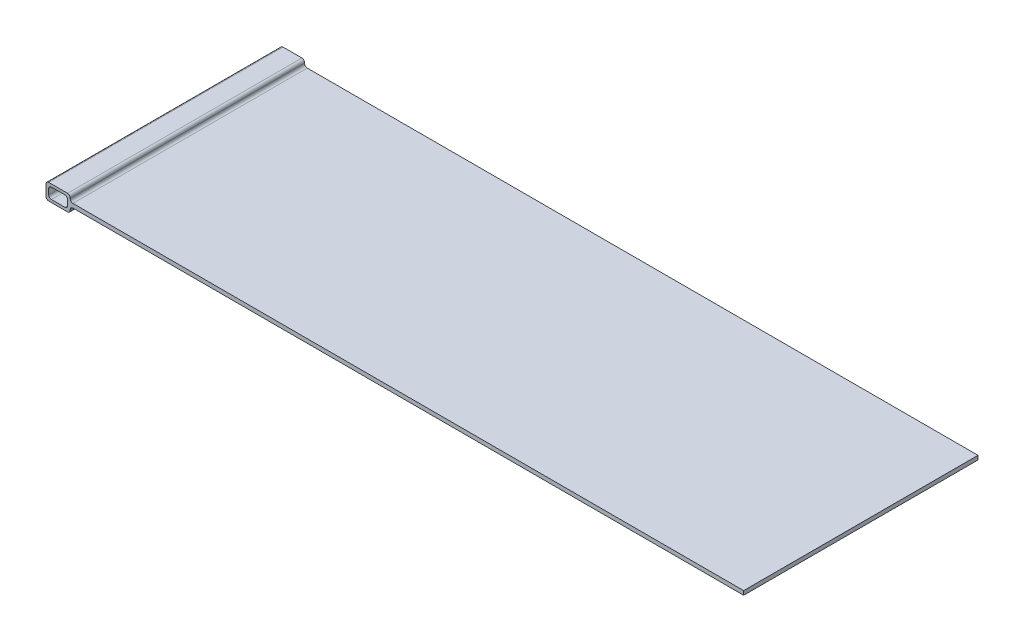
ISO-10303-21;
HEADER;
FILE_DESCRIPTION(('STEP AP214'),'2;1');
FILE_NAME('part.step','',(''),(''),'','','');
FILE_SCHEMA(('AUTOMOTIVE_DESIGN { 1 0 10303 214 1 1 1 1 }'));
ENDSEC;
DATA;
#1=APPLICATION_CONTEXT('core data for automotive mechanical design processes');
#2=APPLICATION_PROTOCOL_DEFINITION('international standard','automotive_design',2000,#1);
#3=PRODUCT_CONTEXT('',#1,'mechanical');
#4=PRODUCT('Part','Part','',(#3));
#5=PRODUCT_RELATED_PRODUCT_CATEGORY('part','',(#4));
#6=PRODUCT_DEFINITION_FORMATION('','',#4);
#7=PRODUCT_DEFINITION_CONTEXT('part definition',#1,'design');
#8=PRODUCT_DEFINITION('design','',#6,#7);
#9=PRODUCT_DEFINITION_SHAPE('','',#8);
#10=(LENGTH_UNIT() NAMED_UNIT(*) SI_UNIT(.MILLI.,.METRE.));
#11=(NAMED_UNIT(*) PLANE_ANGLE_UNIT() SI_UNIT($,.RADIAN.));
#12=(NAMED_UNIT(*) SI_UNIT($,.STERADIAN.) SOLID_ANGLE_UNIT());
#13=UNCERTAINTY_MEASURE_WITH_UNIT(LENGTH_MEASURE(1.E-05),#10,'distance_accuracy_value','');
#14=(GEOMETRIC_REPRESENTATION_CONTEXT(3) GLOBAL_UNCERTAINTY_ASSIGNED_CONTEXT((#13)) GLOBAL_UNIT_ASSIGNED_CONTEXT((#10,
#11,#12)) REPRESENTATION_CONTEXT('',''));
#15=CARTESIAN_POINT('',(0.,0.,0.));
#16=DIRECTION('',(0.,0.,1.));
#17=DIRECTION('',(1.,0.,0.));
#18=AXIS2_PLACEMENT_3D('',#15,#16,#17);
#19=CARTESIAN_POINT('',(259.,-2.25,87.));
#20=DIRECTION('',(-1.,0.,0.));
#21=DIRECTION('',(0.,0.,1.));
#22=AXIS2_PLACEMENT_3D('',#19,#20,#21);
#23=PLANE('',#22);
#24=DIRECTION('',(0.,1.,0.));
#25=VECTOR('',#24,1.);
#26=CARTESIAN_POINT('',(259.,-2.25,0.));
#27=LINE('',#26,#25);
#28=CARTESIAN_POINT('',(259.,-3.75,0.));
#29=VERTEX_POINT('',#28);
#30=CARTESIAN_POINT('',(259.,-2.25,0.));
#31=VERTEX_POINT('',#30);
#32=EDGE_CURVE('E240',#29,#31,#27,.T.);
#33=ORIENTED_EDGE('',*,*,#32,.T.);
#34=DIRECTION('',(0.,0.,-1.));
#35=VECTOR('',#34,1.);
#36=CARTESIAN_POINT('',(259.,-2.25,87.));
#37=LINE('',#36,#35);
#38=CARTESIAN_POINT('',(259.,-2.25,87.));
#39=VERTEX_POINT('',#38);
#40=EDGE_CURVE('E11',#39,#31,#37,.T.);
#41=ORIENTED_EDGE('',*,*,#40,.F.);
#42=DIRECTION('',(0.,1.,0.));
#43=VECTOR('',#42,1.);
#44=CARTESIAN_POINT('',(259.,-2.25,87.));
#45=LINE('',#44,#43);
#46=CARTESIAN_POINT('',(259.,-3.75,87.));
#47=VERTEX_POINT('',#46);
#48=EDGE_CURVE('E252',#47,#39,#45,.T.);
#49=ORIENTED_EDGE('',*,*,#48,.F.);
#50=DIRECTION('',(0.,0.,-1.));
#51=VECTOR('',#50,1.);
#52=CARTESIAN_POINT('',(259.,-3.75,87.));
#53=LINE('',#52,#51);
#54=EDGE_CURVE('E282',#47,#29,#53,.T.);
#55=ORIENTED_EDGE('',*,*,#54,.T.);
#56=EDGE_LOOP('',(#33,#41,#49,#55));
#57=FACE_BOUND('',#56,.T.);
#58=ADVANCED_FACE('F35',(#57),#23,.F.);
#59=CARTESIAN_POINT('',(10.,-2.25,87.));
#60=DIRECTION('',(0.,-1.,0.));
#61=DIRECTION('',(0.,0.,-1.));
#62=AXIS2_PLACEMENT_3D('',#59,#60,#61);
#63=PLANE('',#62);
#64=DIRECTION('',(-1.,0.,0.));
#65=VECTOR('',#64,1.);
#66=CARTESIAN_POINT('',(10.,-2.25,0.));
#67=LINE('',#66,#65);
#68=CARTESIAN_POINT('',(10.,-2.25,0.));
#69=VERTEX_POINT('',#68);
#70=EDGE_CURVE('E285',#31,#69,#67,.T.);
#71=ORIENTED_EDGE('',*,*,#70,.T.);
#72=DIRECTION('',(0.,0.,-1.));
#73=VECTOR('',#72,1.);
#74=CARTESIAN_POINT('',(10.,-2.25,87.));
#75=LINE('',#74,#73);
#76=CARTESIAN_POINT('',(10.,-2.25,87.));
#77=VERTEX_POINT('',#76);
#78=EDGE_CURVE('E42',#77,#69,#75,.T.);
#79=ORIENTED_EDGE('',*,*,#78,.F.);
#80=DIRECTION('',(-1.,0.,0.));
#81=VECTOR('',#80,1.);
#82=CARTESIAN_POINT('',(10.,-2.25,87.));
#83=LINE('',#82,#81);
#84=EDGE_CURVE('E255',#39,#77,#83,.T.);
#85=ORIENTED_EDGE('',*,*,#84,.F.);
#86=ORIENTED_EDGE('',*,*,#40,.T.);
#87=EDGE_LOOP('',(#71,#79,#85,#86));
#88=FACE_BOUND('',#87,.T.);
#89=ADVANCED_FACE('F370',(#88),#63,.F.);
#90=CARTESIAN_POINT('',(10.,-1.25,87.));
#91=DIRECTION('',(0.,0.,-1.));
#92=DIRECTION('',(-1.,0.,0.));
#93=AXIS2_PLACEMENT_3D('',#90,#91,#92);
#94=CYLINDRICAL_SURFACE('',#93,1.);
#95=CARTESIAN_POINT('',(10.,-1.25,0.));
#96=DIRECTION('',(0.,0.,-1.));
#97=DIRECTION('',(-1.,0.,0.));
#98=AXIS2_PLACEMENT_3D('',#95,#96,#97);
#99=CIRCLE('',#98,1.);
#100=CARTESIAN_POINT('',(9.,-1.24999999999999,0.));
#101=VERTEX_POINT('',#100);
#102=EDGE_CURVE('E287',#69,#101,#99,.T.);
#103=ORIENTED_EDGE('',*,*,#102,.T.);
#104=DIRECTION('',(0.,0.,-1.));
#105=VECTOR('',#104,1.);
#106=CARTESIAN_POINT('',(9.,-1.24999999999999,87.));
#107=LINE('',#106,#105);
#108=CARTESIAN_POINT('',(9.,-1.24999999999999,87.));
#109=VERTEX_POINT('',#108);
#110=EDGE_CURVE('E342',#109,#101,#107,.T.);
#111=ORIENTED_EDGE('',*,*,#110,.F.);
#112=CARTESIAN_POINT('',(10.,-1.25,87.));
#113=DIRECTION('',(0.,0.,-1.));
#114=DIRECTION('',(-1.,0.,0.));
#115=AXIS2_PLACEMENT_3D('',#112,#113,#114);
#116=CIRCLE('',#115,1.);
#117=EDGE_CURVE('E258',#77,#109,#116,.T.);
#118=ORIENTED_EDGE('',*,*,#117,.F.);
#119=ORIENTED_EDGE('',*,*,#78,.T.);
#120=EDGE_LOOP('',(#103,#111,#118,#119));
#121=FACE_BOUND('',#120,.T.);
#122=ADVANCED_FACE('F349',(#121),#94,.F.);
#123=CARTESIAN_POINT('',(9.,-1.24999999999999,87.));
#124=DIRECTION('',(-1.,0.,0.));
#125=DIRECTION('',(0.,0.,1.));
#126=AXIS2_PLACEMENT_3D('',#123,#124,#125);
#127=PLANE('',#126);
#128=DIRECTION('',(0.,1.,0.));
#129=VECTOR('',#128,1.);
#130=CARTESIAN_POINT('',(9.,-1.24999999999999,0.));
#131=LINE('',#130,#129);
#132=CARTESIAN_POINT('',(9.,-1.00000000000001,0.));
#133=VERTEX_POINT('',#132);
#134=EDGE_CURVE('E289',#101,#133,#131,.T.);
#135=ORIENTED_EDGE('',*,*,#134,.T.);
#136=DIRECTION('',(0.,0.,-1.));
#137=VECTOR('',#136,1.);
#138=CARTESIAN_POINT('',(9.,-1.00000000000001,87.));
#139=LINE('',#138,#137);
#140=CARTESIAN_POINT('',(9.,-1.00000000000001,87.));
#141=VERTEX_POINT('',#140);
#142=EDGE_CURVE('E339',#141,#133,#139,.T.);
#143=ORIENTED_EDGE('',*,*,#142,.F.);
#144=DIRECTION('',(0.,1.,0.));
#145=VECTOR('',#144,1.);
#146=CARTESIAN_POINT('',(9.,-1.24999999999999,87.));
#147=LINE('',#146,#145);
#148=EDGE_CURVE('E260',#109,#141,#147,.T.);
#149=ORIENTED_EDGE('',*,*,#148,.F.);
#150=ORIENTED_EDGE('',*,*,#110,.T.);
#151=EDGE_LOOP('',(#135,#143,#149,#150));
#152=FACE_BOUND('',#151,.T.);
#153=ADVANCED_FACE('F358',(#152),#127,.F.);
#154=CARTESIAN_POINT('',(8.,-1.,87.));
#155=DIRECTION('',(0.,0.,-1.));
#156=DIRECTION('',(-1.,0.,0.));
#157=AXIS2_PLACEMENT_3D('',#154,#155,#156);
#158=CYLINDRICAL_SURFACE('',#157,1.);
#159=CARTESIAN_POINT('',(8.,-1.,0.));
#160=DIRECTION('',(0.,0.,1.));
#161=DIRECTION('',(-1.,0.,0.));
#162=AXIS2_PLACEMENT_3D('',#159,#160,#161);
#163=CIRCLE('',#162,1.);
#164=CARTESIAN_POINT('',(7.99999999999999,0.,0.));
#165=VERTEX_POINT('',#164);
#166=EDGE_CURVE('E291',#133,#165,#163,.T.);
#167=ORIENTED_EDGE('',*,*,#166,.T.);
#168=DIRECTION('',(0.,0.,-1.));
#169=VECTOR('',#168,1.);
#170=CARTESIAN_POINT('',(7.99999999999999,0.,87.));
#171=LINE('',#170,#169);
#172=CARTESIAN_POINT('',(7.99999999999999,0.,87.));
#173=VERTEX_POINT('',#172);
#174=EDGE_CURVE('E336',#173,#165,#171,.T.);
#175=ORIENTED_EDGE('',*,*,#174,.F.);
#176=CARTESIAN_POINT('',(8.,-1.,87.));
#177=DIRECTION('',(0.,0.,1.));
#178=DIRECTION('',(-1.,0.,0.));
#179=AXIS2_PLACEMENT_3D('',#176,#177,#178);
#180=CIRCLE('',#179,1.);
#181=EDGE_CURVE('E262',#141,#173,#180,.T.);
#182=ORIENTED_EDGE('',*,*,#181,.F.);
#183=ORIENTED_EDGE('',*,*,#142,.T.);
#184=EDGE_LOOP('',(#167,#175,#182,#183));
#185=FACE_BOUND('',#184,.T.);
#186=ADVANCED_FACE('F362',(#185),#158,.T.);
#187=CARTESIAN_POINT('',(1.00000000000001,0.,87.));
#188=DIRECTION('',(0.,-1.,0.));
#189=DIRECTION('',(0.,0.,-1.));
#190=AXIS2_PLACEMENT_3D('',#187,#188,#189);
#191=PLANE('',#190);
#192=DIRECTION('',(-1.,0.,0.));
#193=VECTOR('',#192,1.);
#194=CARTESIAN_POINT('',(1.00000000000001,0.,0.));
#195=LINE('',#194,#193);
#196=CARTESIAN_POINT('',(1.00000000000001,0.,0.));
#197=VERTEX_POINT('',#196);
#198=EDGE_CURVE('E293',#165,#197,#195,.T.);
#199=ORIENTED_EDGE('',*,*,#198,.T.);
#200=DIRECTION('',(0.,0.,-1.));
#201=VECTOR('',#200,1.);
#202=CARTESIAN_POINT('',(1.00000000000001,0.,87.));
#203=LINE('',#202,#201);
#204=CARTESIAN_POINT('',(1.00000000000001,0.,87.));
#205=VERTEX_POINT('',#204);
#206=EDGE_CURVE('E333',#205,#197,#203,.T.);
#207=ORIENTED_EDGE('',*,*,#206,.F.);
#208=DIRECTION('',(-1.,0.,0.));
#209=VECTOR('',#208,1.);
#210=CARTESIAN_POINT('',(1.00000000000001,0.,87.));
#211=LINE('',#210,#209);
#212=EDGE_CURVE('E264',#173,#205,#211,.T.);
#213=ORIENTED_EDGE('',*,*,#212,.F.);
#214=ORIENTED_EDGE('',*,*,#174,.T.);
#215=EDGE_LOOP('',(#199,#207,#213,#214));
#216=FACE_BOUND('',#215,.T.);
#217=ADVANCED_FACE('F413',(#216),#191,.F.);
#218=CARTESIAN_POINT('',(1.,-1.,87.));
#219=DIRECTION('',(0.,0.,-1.));
#220=DIRECTION('',(-1.,0.,0.));
#221=AXIS2_PLACEMENT_3D('',#218,#219,#220);
#222=CYLINDRICAL_SURFACE('',#221,1.);
#223=CARTESIAN_POINT('',(1.,-1.,0.));
#224=DIRECTION('',(0.,0.,1.));
#225=DIRECTION('',(1.,0.,0.));
#226=AXIS2_PLACEMENT_3D('',#223,#224,#225);
#227=CIRCLE('',#226,1.);
#228=CARTESIAN_POINT('',(0.,-1.00000000000001,0.));
#229=VERTEX_POINT('',#228);
#230=EDGE_CURVE('E295',#197,#229,#227,.T.);
#231=ORIENTED_EDGE('',*,*,#230,.T.);
#232=DIRECTION('',(0.,0.,-1.));
#233=VECTOR('',#232,1.);
#234=CARTESIAN_POINT('',(0.,-1.00000000000001,87.));
#235=LINE('',#234,#233);
#236=CARTESIAN_POINT('',(0.,-1.00000000000001,87.));
#237=VERTEX_POINT('',#236);
#238=EDGE_CURVE('E330',#237,#229,#235,.T.);
#239=ORIENTED_EDGE('',*,*,#238,.F.);
#240=CARTESIAN_POINT('',(1.,-1.,87.));
#241=DIRECTION('',(0.,0.,1.));
#242=DIRECTION('',(1.,0.,0.));
#243=AXIS2_PLACEMENT_3D('',#240,#241,#242);
#244=CIRCLE('',#243,1.);
#245=EDGE_CURVE('E266',#205,#237,#244,.T.);
#246=ORIENTED_EDGE('',*,*,#245,.F.);
#247=ORIENTED_EDGE('',*,*,#206,.T.);
#248=EDGE_LOOP('',(#231,#239,#246,#247));
#249=FACE_BOUND('',#248,.T.);
#250=ADVANCED_FACE('F411',(#249),#222,.T.);
#251=CARTESIAN_POINT('',(0.,-1.00000000000001,87.));
#252=DIRECTION('',(1.,0.,0.));
#253=DIRECTION('',(0.,1.,0.));
#254=AXIS2_PLACEMENT_3D('',#251,#252,#253);
#255=PLANE('',#254);
#256=DIRECTION('',(0.,-1.,0.));
#257=VECTOR('',#256,1.);
#258=CARTESIAN_POINT('',(0.,-1.00000000000001,0.));
#259=LINE('',#258,#257);
#260=CARTESIAN_POINT('',(0.,-4.99999999999999,0.));
#261=VERTEX_POINT('',#260);
#262=EDGE_CURVE('E297',#229,#261,#259,.T.);
#263=ORIENTED_EDGE('',*,*,#262,.T.);
#264=DIRECTION('',(0.,0.,-1.));
#265=VECTOR('',#264,1.);
#266=CARTESIAN_POINT('',(0.,-4.99999999999999,87.));
#267=LINE('',#266,#265);
#268=CARTESIAN_POINT('',(0.,-4.99999999999999,87.));
#269=VERTEX_POINT('',#268);
#270=EDGE_CURVE('E327',#269,#261,#267,.T.);
#271=ORIENTED_EDGE('',*,*,#270,.F.);
#272=DIRECTION('',(0.,-1.,0.));
#273=VECTOR('',#272,1.);
#274=CARTESIAN_POINT('',(0.,-1.00000000000001,87.));
#275=LINE('',#274,#273);
#276=EDGE_CURVE('E268',#237,#269,#275,.T.);
#277=ORIENTED_EDGE('',*,*,#276,.F.);
#278=ORIENTED_EDGE('',*,*,#238,.T.);
#279=EDGE_LOOP('',(#263,#271,#277,#278));
#280=FACE_BOUND('',#279,.T.);
#281=ADVANCED_FACE('F406',(#280),#255,.F.);
#282=CARTESIAN_POINT('',(1.,-5.,87.));
#283=DIRECTION('',(0.,0.,-1.));
#284=DIRECTION('',(-1.,0.,0.));
#285=AXIS2_PLACEMENT_3D('',#282,#283,#284);
#286=CYLINDRICAL_SURFACE('',#285,1.);
#287=CARTESIAN_POINT('',(1.,-5.,0.));
#288=DIRECTION('',(0.,0.,1.));
#289=DIRECTION('',(1.,0.,0.));
#290=AXIS2_PLACEMENT_3D('',#287,#288,#289);
#291=CIRCLE('',#290,1.);
#292=CARTESIAN_POINT('',(1.00000000000001,-6.,0.));
#293=VERTEX_POINT('',#292);
#294=EDGE_CURVE('E299',#261,#293,#291,.T.);
#295=ORIENTED_EDGE('',*,*,#294,.T.);
#296=DIRECTION('',(0.,0.,-1.));
#297=VECTOR('',#296,1.);
#298=CARTESIAN_POINT('',(1.00000000000001,-6.,87.));
#299=LINE('',#298,#297);
#300=CARTESIAN_POINT('',(1.00000000000001,-6.,87.));
#301=VERTEX_POINT('',#300);
#302=EDGE_CURVE('E324',#301,#293,#299,.T.);
#303=ORIENTED_EDGE('',*,*,#302,.F.);
#304=CARTESIAN_POINT('',(1.,-5.,87.));
#305=DIRECTION('',(0.,0.,1.));
#306=DIRECTION('',(1.,0.,0.));
#307=AXIS2_PLACEMENT_3D('',#304,#305,#306);
#308=CIRCLE('',#307,1.);
#309=EDGE_CURVE('E270',#269,#301,#308,.T.);
#310=ORIENTED_EDGE('',*,*,#309,.F.);
#311=ORIENTED_EDGE('',*,*,#270,.T.);
#312=EDGE_LOOP('',(#295,#303,#310,#311));
#313=FACE_BOUND('',#312,.T.);
#314=ADVANCED_FACE('F401',(#313),#286,.T.);
#315=CARTESIAN_POINT('',(1.00000000000001,-6.,87.));
#316=DIRECTION('',(0.,1.,0.));
#317=DIRECTION('',(-1.,0.,0.));
#318=AXIS2_PLACEMENT_3D('',#315,#316,#317);
#319=PLANE('',#318);
#320=DIRECTION('',(1.,0.,0.));
#321=VECTOR('',#320,1.);
#322=CARTESIAN_POINT('',(1.00000000000001,-6.,0.));
#323=LINE('',#322,#321);
#324=CARTESIAN_POINT('',(7.99999999999999,-6.,0.));
#325=VERTEX_POINT('',#324);
#326=EDGE_CURVE('E301',#293,#325,#323,.T.);
#327=ORIENTED_EDGE('',*,*,#326,.T.);
#328=DIRECTION('',(0.,0.,-1.));
#329=VECTOR('',#328,1.);
#330=CARTESIAN_POINT('',(7.99999999999999,-6.,87.));
#331=LINE('',#330,#329);
#332=CARTESIAN_POINT('',(7.99999999999999,-6.,87.));
#333=VERTEX_POINT('',#332);
#334=EDGE_CURVE('E321',#333,#325,#331,.T.);
#335=ORIENTED_EDGE('',*,*,#334,.F.);
#336=DIRECTION('',(1.,0.,0.));
#337=VECTOR('',#336,1.);
#338=CARTESIAN_POINT('',(1.00000000000001,-6.,87.));
#339=LINE('',#338,#337);
#340=EDGE_CURVE('E272',#301,#333,#339,.T.);
#341=ORIENTED_EDGE('',*,*,#340,.F.);
#342=ORIENTED_EDGE('',*,*,#302,.T.);
#343=EDGE_LOOP('',(#327,#335,#341,#342));
#344=FACE_BOUND('',#343,.T.);
#345=ADVANCED_FACE('F397',(#344),#319,.F.);
#346=CARTESIAN_POINT('',(8.,-5.,87.));
#347=DIRECTION('',(0.,0.,-1.));
#348=DIRECTION('',(-1.,0.,0.));
#349=AXIS2_PLACEMENT_3D('',#346,#347,#348);
#350=CYLINDRICAL_SURFACE('',#349,1.);
#351=CARTESIAN_POINT('',(8.,-5.,0.));
#352=DIRECTION('',(0.,0.,1.));
#353=DIRECTION('',(1.,0.,0.));
#354=AXIS2_PLACEMENT_3D('',#351,#352,#353);
#355=CIRCLE('',#354,1.);
#356=CARTESIAN_POINT('',(9.,-4.99999999999999,0.));
#357=VERTEX_POINT('',#356);
#358=EDGE_CURVE('E303',#325,#357,#355,.T.);
#359=ORIENTED_EDGE('',*,*,#358,.T.);
#360=DIRECTION('',(0.,0.,-1.));
#361=VECTOR('',#360,1.);
#362=CARTESIAN_POINT('',(9.,-4.99999999999999,87.));
#363=LINE('',#362,#361);
#364=CARTESIAN_POINT('',(9.,-4.99999999999999,87.));
#365=VERTEX_POINT('',#364);
#366=EDGE_CURVE('E318',#365,#357,#363,.T.);
#367=ORIENTED_EDGE('',*,*,#366,.F.);
#368=CARTESIAN_POINT('',(8.,-5.,87.));
#369=DIRECTION('',(0.,0.,1.));
#370=DIRECTION('',(1.,0.,0.));
#371=AXIS2_PLACEMENT_3D('',#368,#369,#370);
#372=CIRCLE('',#371,1.);
#373=EDGE_CURVE('E274',#333,#365,#372,.T.);
#374=ORIENTED_EDGE('',*,*,#373,.F.);
#375=ORIENTED_EDGE('',*,*,#334,.T.);
#376=EDGE_LOOP('',(#359,#367,#374,#375));
#377=FACE_BOUND('',#376,.T.);
#378=ADVANCED_FACE('F392',(#377),#350,.T.);
#379=CARTESIAN_POINT('',(9.,-4.75000000000001,87.));
#380=DIRECTION('',(-1.,0.,0.));
#381=DIRECTION('',(0.,0.,1.));
#382=AXIS2_PLACEMENT_3D('',#379,#380,#381);
#383=PLANE('',#382);
#384=DIRECTION('',(0.,1.,0.));
#385=VECTOR('',#384,1.);
#386=CARTESIAN_POINT('',(9.,-4.75000000000001,0.));
#387=LINE('',#386,#385);
#388=CARTESIAN_POINT('',(9.,-4.75000000000001,0.));
#389=VERTEX_POINT('',#388);
#390=EDGE_CURVE('E305',#357,#389,#387,.T.);
#391=ORIENTED_EDGE('',*,*,#390,.T.);
#392=DIRECTION('',(0.,0.,-1.));
#393=VECTOR('',#392,1.);
#394=CARTESIAN_POINT('',(9.,-4.75000000000001,87.));
#395=LINE('',#394,#393);
#396=CARTESIAN_POINT('',(9.,-4.75000000000001,87.));
#397=VERTEX_POINT('',#396);
#398=EDGE_CURVE('E315',#397,#389,#395,.T.);
#399=ORIENTED_EDGE('',*,*,#398,.F.);
#400=DIRECTION('',(0.,1.,0.));
#401=VECTOR('',#400,1.);
#402=CARTESIAN_POINT('',(9.,-4.75000000000001,87.));
#403=LINE('',#402,#401);
#404=EDGE_CURVE('E276',#365,#397,#403,.T.);
#405=ORIENTED_EDGE('',*,*,#404,.F.);
#406=ORIENTED_EDGE('',*,*,#366,.T.);
#407=EDGE_LOOP('',(#391,#399,#405,#406));
#408=FACE_BOUND('',#407,.T.);
#409=ADVANCED_FACE('F386',(#408),#383,.F.);
#410=CARTESIAN_POINT('',(10.,-4.75,87.));
#411=DIRECTION('',(0.,0.,-1.));
#412=DIRECTION('',(-1.,0.,0.));
#413=AXIS2_PLACEMENT_3D('',#410,#411,#412);
#414=CYLINDRICAL_SURFACE('',#413,1.);
#415=CARTESIAN_POINT('',(10.,-4.75,0.));
#416=DIRECTION('',(0.,0.,-1.));
#417=DIRECTION('',(-1.,0.,0.));
#418=AXIS2_PLACEMENT_3D('',#415,#416,#417);
#419=CIRCLE('',#418,1.);
#420=CARTESIAN_POINT('',(10.,-3.75,0.));
#421=VERTEX_POINT('',#420);
#422=EDGE_CURVE('E307',#389,#421,#419,.T.);
#423=ORIENTED_EDGE('',*,*,#422,.T.);
#424=DIRECTION('',(0.,0.,-1.));
#425=VECTOR('',#424,1.);
#426=CARTESIAN_POINT('',(10.,-3.75,87.));
#427=LINE('',#426,#425);
#428=CARTESIAN_POINT('',(10.,-3.75,87.));
#429=VERTEX_POINT('',#428);
#430=EDGE_CURVE('E312',#429,#421,#427,.T.);
#431=ORIENTED_EDGE('',*,*,#430,.F.);
#432=CARTESIAN_POINT('',(10.,-4.75,87.));
#433=DIRECTION('',(0.,0.,-1.));
#434=DIRECTION('',(-1.,0.,0.));
#435=AXIS2_PLACEMENT_3D('',#432,#433,#434);
#436=CIRCLE('',#435,1.);
#437=EDGE_CURVE('E278',#397,#429,#436,.T.);
#438=ORIENTED_EDGE('',*,*,#437,.F.);
#439=ORIENTED_EDGE('',*,*,#398,.T.);
#440=EDGE_LOOP('',(#423,#431,#438,#439));
#441=FACE_BOUND('',#440,.T.);
#442=ADVANCED_FACE('F382',(#441),#414,.F.);
#443=CARTESIAN_POINT('',(10.,-3.75,87.));
#444=DIRECTION('',(0.,1.,0.));
#445=DIRECTION('',(0.,0.,1.));
#446=AXIS2_PLACEMENT_3D('',#443,#444,#445);
#447=PLANE('',#446);
#448=DIRECTION('',(1.,0.,0.));
#449=VECTOR('',#448,1.);
#450=CARTESIAN_POINT('',(10.,-3.75,0.));
#451=LINE('',#450,#449);
#452=EDGE_CURVE('E256',#421,#29,#451,.T.);
#453=ORIENTED_EDGE('',*,*,#452,.T.);
#454=ORIENTED_EDGE('',*,*,#54,.F.);
#455=DIRECTION('',(1.,0.,0.));
#456=VECTOR('',#455,1.);
#457=CARTESIAN_POINT('',(10.,-3.75,87.));
#458=LINE('',#457,#456);
#459=EDGE_CURVE('E280',#429,#47,#458,.T.);
#460=ORIENTED_EDGE('',*,*,#459,.F.);
#461=ORIENTED_EDGE('',*,*,#430,.T.);
#462=EDGE_LOOP('',(#453,#454,#460,#461));
#463=FACE_BOUND('',#462,.T.);
#464=ADVANCED_FACE('F377',(#463),#447,.F.);
#465=CARTESIAN_POINT('',(10.,-4.75,87.));
#466=DIRECTION('',(0.,0.,-1.));
#467=DIRECTION('',(-1.,0.,0.));
#468=AXIS2_PLACEMENT_3D('',#465,#466,#467);
#469=PLANE('',#468);
#470=DIRECTION('',(-1.,0.,0.));
#471=VECTOR('',#470,1.);
#472=CARTESIAN_POINT('',(2.00000000000001,-1.,87.));
#473=LINE('',#472,#471);
#474=CARTESIAN_POINT('',(6.99999999999999,-1.,87.));
#475=VERTEX_POINT('',#474);
#476=CARTESIAN_POINT('',(2.00000000000001,-1.,87.));
#477=VERTEX_POINT('',#476);
#478=EDGE_CURVE('E222',#475,#477,#473,.T.);
#479=ORIENTED_EDGE('',*,*,#478,.F.);
#480=CARTESIAN_POINT('',(7.,-2.,87.));
#481=DIRECTION('',(0.,0.,1.));
#482=DIRECTION('',(-1.,0.,0.));
#483=AXIS2_PLACEMENT_3D('',#480,#481,#482);
#484=CIRCLE('',#483,1.);
#485=CARTESIAN_POINT('',(8.,-2.00000000000001,87.));
#486=VERTEX_POINT('',#485);
#487=EDGE_CURVE('E49',#486,#475,#484,.T.);
#488=ORIENTED_EDGE('',*,*,#487,.F.);
#489=DIRECTION('',(0.,1.,0.));
#490=VECTOR('',#489,1.);
#491=CARTESIAN_POINT('',(8.,-2.00000000000001,87.));
#492=LINE('',#491,#490);
#493=CARTESIAN_POINT('',(8.,-3.99999999999999,87.));
#494=VERTEX_POINT('',#493);
#495=EDGE_CURVE('E202',#494,#486,#492,.T.);
#496=ORIENTED_EDGE('',*,*,#495,.F.);
#497=CARTESIAN_POINT('',(7.,-4.,87.));
#498=DIRECTION('',(0.,0.,1.));
#499=DIRECTION('',(1.,0.,0.));
#500=AXIS2_PLACEMENT_3D('',#497,#498,#499);
#501=CIRCLE('',#500,1.);
#502=CARTESIAN_POINT('',(6.99999999999999,-5.,87.));
#503=VERTEX_POINT('',#502);
#504=EDGE_CURVE('E205',#503,#494,#501,.T.);
#505=ORIENTED_EDGE('',*,*,#504,.F.);
#506=DIRECTION('',(1.,0.,0.));
#507=VECTOR('',#506,1.);
#508=CARTESIAN_POINT('',(2.00000000000001,-5.,87.));
#509=LINE('',#508,#507);
#510=CARTESIAN_POINT('',(2.00000000000001,-5.,87.));
#511=VERTEX_POINT('',#510);
#512=EDGE_CURVE('E233',#511,#503,#509,.T.);
#513=ORIENTED_EDGE('',*,*,#512,.F.);
#514=CARTESIAN_POINT('',(2.,-4.,87.));
#515=DIRECTION('',(0.,0.,1.));
#516=DIRECTION('',(1.,0.,0.));
#517=AXIS2_PLACEMENT_3D('',#514,#515,#516);
#518=CIRCLE('',#517,1.);
#519=CARTESIAN_POINT('',(1.,-3.99999999999999,87.));
#520=VERTEX_POINT('',#519);
#521=EDGE_CURVE('E230',#520,#511,#518,.T.);
#522=ORIENTED_EDGE('',*,*,#521,.F.);
#523=DIRECTION('',(0.,-1.,0.));
#524=VECTOR('',#523,1.);
#525=CARTESIAN_POINT('',(1.,-2.00000000000001,87.));
#526=LINE('',#525,#524);
#527=CARTESIAN_POINT('',(1.,-2.00000000000001,87.));
#528=VERTEX_POINT('',#527);
#529=EDGE_CURVE('E227',#528,#520,#526,.T.);
#530=ORIENTED_EDGE('',*,*,#529,.F.);
#531=CARTESIAN_POINT('',(2.,-2.,87.));
#532=DIRECTION('',(0.,0.,1.));
#533=DIRECTION('',(1.,0.,0.));
#534=AXIS2_PLACEMENT_3D('',#531,#532,#533);
#535=CIRCLE('',#534,1.);
#536=EDGE_CURVE('E224',#477,#528,#535,.T.);
#537=ORIENTED_EDGE('',*,*,#536,.F.);
#538=EDGE_LOOP('',(#479,#488,#496,#505,#513,#522,#530,#537));
#539=FACE_BOUND('',#538,.T.);
#540=ORIENTED_EDGE('',*,*,#48,.T.);
#541=ORIENTED_EDGE('',*,*,#84,.T.);
#542=ORIENTED_EDGE('',*,*,#117,.T.);
#543=ORIENTED_EDGE('',*,*,#148,.T.);
#544=ORIENTED_EDGE('',*,*,#181,.T.);
#545=ORIENTED_EDGE('',*,*,#212,.T.);
#546=ORIENTED_EDGE('',*,*,#245,.T.);
#547=ORIENTED_EDGE('',*,*,#276,.T.);
#548=ORIENTED_EDGE('',*,*,#309,.T.);
#549=ORIENTED_EDGE('',*,*,#340,.T.);
#550=ORIENTED_EDGE('',*,*,#373,.T.);
#551=ORIENTED_EDGE('',*,*,#404,.T.);
#552=ORIENTED_EDGE('',*,*,#437,.T.);
#553=ORIENTED_EDGE('',*,*,#459,.T.);
#554=EDGE_LOOP('',(#540,#541,#542,#543,#544,#545,#546,#547,#548,#549,#550,#551,#552,#553));
#555=FACE_BOUND('',#554,.T.);
#556=ADVANCED_FACE('F366',(#539,#555),#469,.F.);
#557=CARTESIAN_POINT('',(10.,-4.75,0.));
#558=DIRECTION('',(0.,0.,-1.));
#559=DIRECTION('',(-1.,0.,0.));
#560=AXIS2_PLACEMENT_3D('',#557,#558,#559);
#561=PLANE('',#560);
#562=CARTESIAN_POINT('',(7.,-2.,0.));
#563=DIRECTION('',(0.,0.,1.));
#564=DIRECTION('',(-1.,0.,0.));
#565=AXIS2_PLACEMENT_3D('',#562,#563,#564);
#566=CIRCLE('',#565,1.);
#567=CARTESIAN_POINT('',(8.,-2.00000000000001,0.));
#568=VERTEX_POINT('',#567);
#569=CARTESIAN_POINT('',(6.99999999999999,-1.,0.));
#570=VERTEX_POINT('',#569);
#571=EDGE_CURVE('E185',#568,#570,#566,.T.);
#572=ORIENTED_EDGE('',*,*,#571,.T.);
#573=DIRECTION('',(-1.,0.,0.));
#574=VECTOR('',#573,1.);
#575=CARTESIAN_POINT('',(2.00000000000001,-1.,0.));
#576=LINE('',#575,#574);
#577=CARTESIAN_POINT('',(2.00000000000001,-1.,0.));
#578=VERTEX_POINT('',#577);
#579=EDGE_CURVE('E194',#570,#578,#576,.T.);
#580=ORIENTED_EDGE('',*,*,#579,.T.);
#581=CARTESIAN_POINT('',(2.,-2.,0.));
#582=DIRECTION('',(0.,0.,1.));
#583=DIRECTION('',(1.,0.,0.));
#584=AXIS2_PLACEMENT_3D('',#581,#582,#583);
#585=CIRCLE('',#584,1.);
#586=CARTESIAN_POINT('',(1.,-2.00000000000001,0.));
#587=VERTEX_POINT('',#586);
#588=EDGE_CURVE('E57',#578,#587,#585,.T.);
#589=ORIENTED_EDGE('',*,*,#588,.T.);
#590=DIRECTION('',(0.,-1.,0.));
#591=VECTOR('',#590,1.);
#592=CARTESIAN_POINT('',(1.,-2.00000000000001,0.));
#593=LINE('',#592,#591);
#594=CARTESIAN_POINT('',(1.,-3.99999999999999,0.));
#595=VERTEX_POINT('',#594);
#596=EDGE_CURVE('E209',#587,#595,#593,.T.);
#597=ORIENTED_EDGE('',*,*,#596,.T.);
#598=CARTESIAN_POINT('',(2.,-4.,0.));
#599=DIRECTION('',(0.,0.,1.));
#600=DIRECTION('',(1.,0.,0.));
#601=AXIS2_PLACEMENT_3D('',#598,#599,#600);
#602=CIRCLE('',#601,1.);
#603=CARTESIAN_POINT('',(2.00000000000001,-5.,0.));
#604=VERTEX_POINT('',#603);
#605=EDGE_CURVE('E212',#595,#604,#602,.T.);
#606=ORIENTED_EDGE('',*,*,#605,.T.);
#607=DIRECTION('',(1.,0.,0.));
#608=VECTOR('',#607,1.);
#609=CARTESIAN_POINT('',(2.00000000000001,-5.,0.));
#610=LINE('',#609,#608);
#611=CARTESIAN_POINT('',(6.99999999999999,-5.,0.));
#612=VERTEX_POINT('',#611);
#613=EDGE_CURVE('E215',#604,#612,#610,.T.);
#614=ORIENTED_EDGE('',*,*,#613,.T.);
#615=CARTESIAN_POINT('',(7.,-4.,0.));
#616=DIRECTION('',(0.,0.,1.));
#617=DIRECTION('',(1.,0.,0.));
#618=AXIS2_PLACEMENT_3D('',#615,#616,#617);
#619=CIRCLE('',#618,1.);
#620=CARTESIAN_POINT('',(8.,-3.99999999999999,0.));
#621=VERTEX_POINT('',#620);
#622=EDGE_CURVE('E218',#612,#621,#619,.T.);
#623=ORIENTED_EDGE('',*,*,#622,.T.);
#624=DIRECTION('',(0.,1.,0.));
#625=VECTOR('',#624,1.);
#626=CARTESIAN_POINT('',(8.,-2.00000000000001,0.));
#627=LINE('',#626,#625);
#628=EDGE_CURVE('E191',#621,#568,#627,.T.);
#629=ORIENTED_EDGE('',*,*,#628,.T.);
#630=EDGE_LOOP('',(#572,#580,#589,#597,#606,#614,#623,#629));
#631=FACE_BOUND('',#630,.T.);
#632=ORIENTED_EDGE('',*,*,#32,.F.);
#633=ORIENTED_EDGE('',*,*,#452,.F.);
#634=ORIENTED_EDGE('',*,*,#422,.F.);
#635=ORIENTED_EDGE('',*,*,#390,.F.);
#636=ORIENTED_EDGE('',*,*,#358,.F.);
#637=ORIENTED_EDGE('',*,*,#326,.F.);
#638=ORIENTED_EDGE('',*,*,#294,.F.);
#639=ORIENTED_EDGE('',*,*,#262,.F.);
#640=ORIENTED_EDGE('',*,*,#230,.F.);
#641=ORIENTED_EDGE('',*,*,#198,.F.);
#642=ORIENTED_EDGE('',*,*,#166,.F.);
#643=ORIENTED_EDGE('',*,*,#134,.F.);
#644=ORIENTED_EDGE('',*,*,#102,.F.);
#645=ORIENTED_EDGE('',*,*,#70,.F.);
#646=EDGE_LOOP('',(#632,#633,#634,#635,#636,#637,#638,#639,#640,#641,#642,#643,#644,#645));
#647=FACE_BOUND('',#646,.T.);
#648=ADVANCED_FACE('F198',(#631,#647),#561,.T.);
#649=CARTESIAN_POINT('',(7.,-2.,0.));
#650=DIRECTION('',(0.,0.,1.));
#651=DIRECTION('',(1.,0.,0.));
#652=AXIS2_PLACEMENT_3D('',#649,#650,#651);
#653=CYLINDRICAL_SURFACE('',#652,1.);
#654=ORIENTED_EDGE('',*,*,#487,.T.);
#655=DIRECTION('',(0.,0.,1.));
#656=VECTOR('',#655,1.);
#657=CARTESIAN_POINT('',(6.99999999999999,-1.,0.));
#658=LINE('',#657,#656);
#659=EDGE_CURVE('E181',#570,#475,#658,.T.);
#660=ORIENTED_EDGE('',*,*,#659,.F.);
#661=ORIENTED_EDGE('',*,*,#571,.F.);
#662=DIRECTION('',(0.,0.,1.));
#663=VECTOR('',#662,1.);
#664=CARTESIAN_POINT('',(8.,-2.00000000000001,0.));
#665=LINE('',#664,#663);
#666=EDGE_CURVE('E238',#568,#486,#665,.T.);
#667=ORIENTED_EDGE('',*,*,#666,.T.);
#668=EDGE_LOOP('',(#654,#660,#661,#667));
#669=FACE_BOUND('',#668,.T.);
#670=ADVANCED_FACE('F183',(#669),#653,.F.);
#671=CARTESIAN_POINT('',(8.,-2.00000000000001,0.));
#672=DIRECTION('',(1.,0.,0.));
#673=DIRECTION('',(0.,0.,-1.));
#674=AXIS2_PLACEMENT_3D('',#671,#672,#673);
#675=PLANE('',#674);
#676=ORIENTED_EDGE('',*,*,#495,.T.);
#677=ORIENTED_EDGE('',*,*,#666,.F.);
#678=ORIENTED_EDGE('',*,*,#628,.F.);
#679=DIRECTION('',(0.,0.,1.));
#680=VECTOR('',#679,1.);
#681=CARTESIAN_POINT('',(8.,-3.99999999999999,0.));
#682=LINE('',#681,#680);
#683=EDGE_CURVE('E241',#621,#494,#682,.T.);
#684=ORIENTED_EDGE('',*,*,#683,.T.);
#685=EDGE_LOOP('',(#676,#677,#678,#684));
#686=FACE_BOUND('',#685,.T.);
#687=ADVANCED_FACE('F532',(#686),#675,.F.);
#688=CARTESIAN_POINT('',(7.,-4.,0.));
#689=DIRECTION('',(0.,0.,1.));
#690=DIRECTION('',(1.,0.,0.));
#691=AXIS2_PLACEMENT_3D('',#688,#689,#690);
#692=CYLINDRICAL_SURFACE('',#691,1.);
#693=ORIENTED_EDGE('',*,*,#504,.T.);
#694=ORIENTED_EDGE('',*,*,#683,.F.);
#695=ORIENTED_EDGE('',*,*,#622,.F.);
#696=DIRECTION('',(0.,0.,1.));
#697=VECTOR('',#696,1.);
#698=CARTESIAN_POINT('',(6.99999999999999,-5.,0.));
#699=LINE('',#698,#697);
#700=EDGE_CURVE('E243',#612,#503,#699,.T.);
#701=ORIENTED_EDGE('',*,*,#700,.T.);
#702=EDGE_LOOP('',(#693,#694,#695,#701));
#703=FACE_BOUND('',#702,.T.);
#704=ADVANCED_FACE('F541',(#703),#692,.F.);
#705=CARTESIAN_POINT('',(2.00000000000001,-5.,0.));
#706=DIRECTION('',(0.,-1.,0.));
#707=DIRECTION('',(0.,0.,-1.));
#708=AXIS2_PLACEMENT_3D('',#705,#706,#707);
#709=PLANE('',#708);
#710=ORIENTED_EDGE('',*,*,#512,.T.);
#711=ORIENTED_EDGE('',*,*,#700,.F.);
#712=ORIENTED_EDGE('',*,*,#613,.F.);
#713=DIRECTION('',(0.,0.,1.));
#714=VECTOR('',#713,1.);
#715=CARTESIAN_POINT('',(2.00000000000001,-5.,0.));
#716=LINE('',#715,#714);
#717=EDGE_CURVE('E245',#604,#511,#716,.T.);
#718=ORIENTED_EDGE('',*,*,#717,.T.);
#719=EDGE_LOOP('',(#710,#711,#712,#718));
#720=FACE_BOUND('',#719,.T.);
#721=ADVANCED_FACE('F551',(#720),#709,.F.);
#722=CARTESIAN_POINT('',(2.,-4.,0.));
#723=DIRECTION('',(0.,0.,1.));
#724=DIRECTION('',(1.,0.,0.));
#725=AXIS2_PLACEMENT_3D('',#722,#723,#724);
#726=CYLINDRICAL_SURFACE('',#725,1.);
#727=ORIENTED_EDGE('',*,*,#521,.T.);
#728=ORIENTED_EDGE('',*,*,#717,.F.);
#729=ORIENTED_EDGE('',*,*,#605,.F.);
#730=DIRECTION('',(0.,0.,1.));
#731=VECTOR('',#730,1.);
#732=CARTESIAN_POINT('',(1.,-3.99999999999999,0.));
#733=LINE('',#732,#731);
#734=EDGE_CURVE('E247',#595,#520,#733,.T.);
#735=ORIENTED_EDGE('',*,*,#734,.T.);
#736=EDGE_LOOP('',(#727,#728,#729,#735));
#737=FACE_BOUND('',#736,.T.);
#738=ADVANCED_FACE('F561',(#737),#726,.F.);
#739=CARTESIAN_POINT('',(1.,-2.00000000000001,0.));
#740=DIRECTION('',(-1.,0.,0.));
#741=DIRECTION('',(0.,-1.,0.));
#742=AXIS2_PLACEMENT_3D('',#739,#740,#741);
#743=PLANE('',#742);
#744=ORIENTED_EDGE('',*,*,#529,.T.);
#745=ORIENTED_EDGE('',*,*,#734,.F.);
#746=ORIENTED_EDGE('',*,*,#596,.F.);
#747=DIRECTION('',(0.,0.,1.));
#748=VECTOR('',#747,1.);
#749=CARTESIAN_POINT('',(1.,-2.00000000000001,0.));
#750=LINE('',#749,#748);
#751=EDGE_CURVE('E249',#587,#528,#750,.T.);
#752=ORIENTED_EDGE('',*,*,#751,.T.);
#753=EDGE_LOOP('',(#744,#745,#746,#752));
#754=FACE_BOUND('',#753,.T.);
#755=ADVANCED_FACE('F571',(#754),#743,.F.);
#756=CARTESIAN_POINT('',(2.,-2.,0.));
#757=DIRECTION('',(0.,0.,1.));
#758=DIRECTION('',(1.,0.,0.));
#759=AXIS2_PLACEMENT_3D('',#756,#757,#758);
#760=CYLINDRICAL_SURFACE('',#759,1.);
#761=ORIENTED_EDGE('',*,*,#536,.T.);
#762=ORIENTED_EDGE('',*,*,#751,.F.);
#763=ORIENTED_EDGE('',*,*,#588,.F.);
#764=DIRECTION('',(0.,0.,1.));
#765=VECTOR('',#764,1.);
#766=CARTESIAN_POINT('',(2.00000000000001,-1.,0.));
#767=LINE('',#766,#765);
#768=EDGE_CURVE('E190',#578,#477,#767,.T.);
#769=ORIENTED_EDGE('',*,*,#768,.T.);
#770=EDGE_LOOP('',(#761,#762,#763,#769));
#771=FACE_BOUND('',#770,.T.);
#772=ADVANCED_FACE('F581',(#771),#760,.F.);
#773=CARTESIAN_POINT('',(2.00000000000001,-1.,0.));
#774=DIRECTION('',(0.,1.,0.));
#775=DIRECTION('',(0.,0.,1.));
#776=AXIS2_PLACEMENT_3D('',#773,#774,#775);
#777=PLANE('',#776);
#778=ORIENTED_EDGE('',*,*,#478,.T.);
#779=ORIENTED_EDGE('',*,*,#768,.F.);
#780=ORIENTED_EDGE('',*,*,#579,.F.);
#781=ORIENTED_EDGE('',*,*,#659,.T.);
#782=EDGE_LOOP('',(#778,#779,#780,#781));
#783=FACE_BOUND('',#782,.T.);
#784=ADVANCED_FACE('F195',(#783),#777,.F.);
#785=CLOSED_SHELL('',(#58,#89,#122,#153,#186,#217,#250,#281,#314,#345,#378,#409,#442,#464,#556,
#648,#670,#687,#704,#721,#738,#755,#772,#784));
#786=MANIFOLD_SOLID_BREP('B2',#785);
#787=ADVANCED_BREP_SHAPE_REPRESENTATION('',(#18,#786),#14);
#788=SHAPE_DEFINITION_REPRESENTATION(#9,#787);
ENDSEC;
END-ISO-10303-21;
